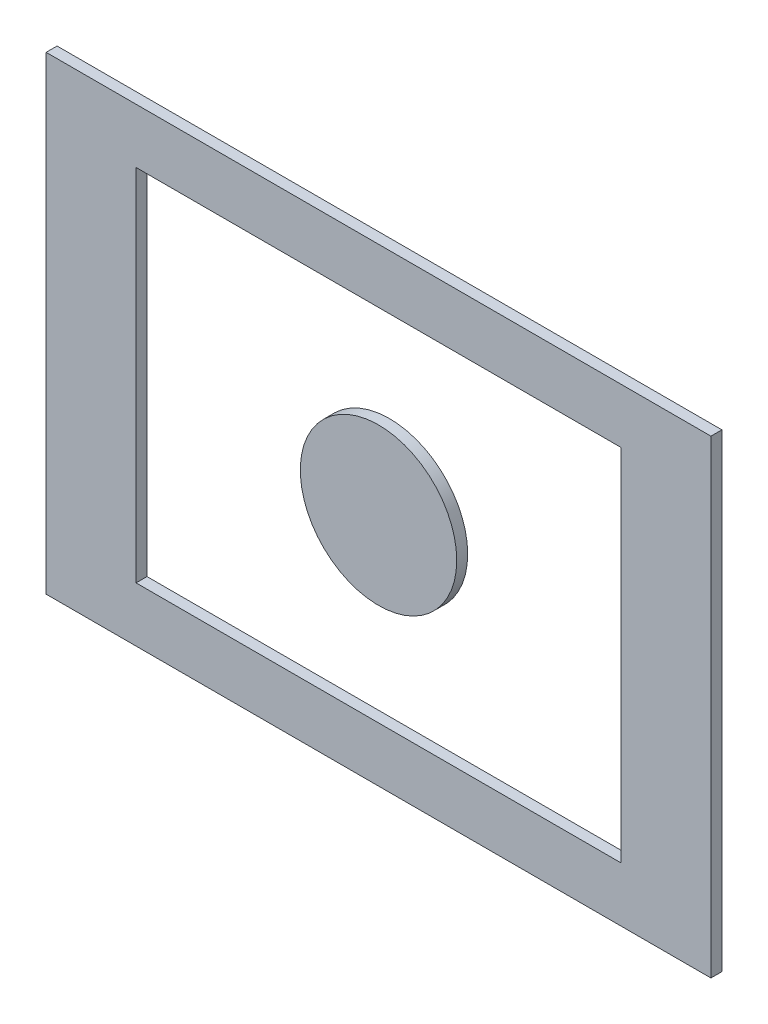
ISO-10303-21;
HEADER;
FILE_DESCRIPTION(('STEP AP214'),'2;1');
FILE_NAME('part.step','',(''),(''),'','','');
FILE_SCHEMA(('AUTOMOTIVE_DESIGN { 1 0 10303 214 1 1 1 1 }'));
ENDSEC;
DATA;
#1=APPLICATION_CONTEXT('core data for automotive mechanical design processes');
#2=APPLICATION_PROTOCOL_DEFINITION('international standard','automotive_design',2000,#1);
#3=PRODUCT_CONTEXT('',#1,'mechanical');
#4=PRODUCT('Part','Part','',(#3));
#5=PRODUCT_RELATED_PRODUCT_CATEGORY('part','',(#4));
#6=PRODUCT_DEFINITION_FORMATION('','',#4);
#7=PRODUCT_DEFINITION_CONTEXT('part definition',#1,'design');
#8=PRODUCT_DEFINITION('design','',#6,#7);
#9=PRODUCT_DEFINITION_SHAPE('','',#8);
#10=(LENGTH_UNIT() NAMED_UNIT(*) SI_UNIT(.MILLI.,.METRE.));
#11=(NAMED_UNIT(*) PLANE_ANGLE_UNIT() SI_UNIT($,.RADIAN.));
#12=(NAMED_UNIT(*) SI_UNIT($,.STERADIAN.) SOLID_ANGLE_UNIT());
#13=UNCERTAINTY_MEASURE_WITH_UNIT(LENGTH_MEASURE(1.E-05),#10,'distance_accuracy_value','');
#14=(GEOMETRIC_REPRESENTATION_CONTEXT(3) GLOBAL_UNCERTAINTY_ASSIGNED_CONTEXT((#13)) GLOBAL_UNIT_ASSIGNED_CONTEXT((#10,
#11,#12)) REPRESENTATION_CONTEXT('',''));
#15=CARTESIAN_POINT('',(0.,0.,0.));
#16=DIRECTION('',(0.,0.,1.));
#17=DIRECTION('',(1.,0.,0.));
#18=AXIS2_PLACEMENT_3D('',#15,#16,#17);
#19=CARTESIAN_POINT('',(0.,0.,0.));
#20=DIRECTION('',(0.,0.,1.));
#21=DIRECTION('',(1.,0.,0.));
#22=AXIS2_PLACEMENT_3D('',#19,#20,#21);
#23=CYLINDRICAL_SURFACE('',#22,10.);
#24=CARTESIAN_POINT('',(0.,0.,0.));
#25=DIRECTION('',(0.,0.,1.));
#26=DIRECTION('',(1.,0.,0.));
#27=AXIS2_PLACEMENT_3D('',#24,#25,#26);
#28=CIRCLE('',#27,10.);
#29=CARTESIAN_POINT('',(10.,0.,0.));
#30=VERTEX_POINT('',#29);
#31=EDGE_CURVE('E11',#30,#30,#28,.T.);
#32=ORIENTED_EDGE('',*,*,#31,.T.);
#33=EDGE_LOOP('',(#32));
#34=FACE_BOUND('',#33,.T.);
#35=CARTESIAN_POINT('',(0.,0.,1.4));
#36=DIRECTION('',(0.,0.,1.));
#37=DIRECTION('',(1.,0.,0.));
#38=AXIS2_PLACEMENT_3D('',#35,#36,#37);
#39=CIRCLE('',#38,10.);
#40=CARTESIAN_POINT('',(10.,0.,1.4));
#41=VERTEX_POINT('',#40);
#42=EDGE_CURVE('E56',#41,#41,#39,.T.);
#43=ORIENTED_EDGE('',*,*,#42,.F.);
#44=EDGE_LOOP('',(#43));
#45=FACE_BOUND('',#44,.T.);
#46=ADVANCED_FACE('F53',(#34,#45),#23,.T.);
#47=CARTESIAN_POINT('',(0.,0.,0.));
#48=DIRECTION('',(0.,0.,1.));
#49=DIRECTION('',(1.,0.,0.));
#50=AXIS2_PLACEMENT_3D('',#47,#48,#49);
#51=PLANE('',#50);
#52=ORIENTED_EDGE('',*,*,#31,.F.);
#53=EDGE_LOOP('',(#52));
#54=FACE_BOUND('',#53,.T.);
#55=ADVANCED_FACE('F68',(#54),#51,.F.);
#56=CARTESIAN_POINT('',(0.,0.,1.4));
#57=DIRECTION('',(0.,0.,1.));
#58=DIRECTION('',(1.,0.,0.));
#59=AXIS2_PLACEMENT_3D('',#56,#57,#58);
#60=PLANE('',#59);
#61=ORIENTED_EDGE('',*,*,#42,.T.);
#62=EDGE_LOOP('',(#61));
#63=FACE_BOUND('',#62,.T.);
#64=ADVANCED_FACE('F65',(#63),#60,.T.);
#65=CLOSED_SHELL('',(#46,#55,#64));
#66=MANIFOLD_SOLID_BREP('B2',#65);
#67=CARTESIAN_POINT('',(0.,0.,1.4));
#68=DIRECTION('',(0.,0.,1.));
#69=DIRECTION('',(1.,0.,0.));
#70=AXIS2_PLACEMENT_3D('',#67,#68,#69);
#71=PLANE('',#70);
#72=DIRECTION('',(0.,1.,0.));
#73=VECTOR('',#72,1.);
#74=CARTESIAN_POINT('',(42.5,30.,1.4));
#75=LINE('',#74,#73);
#76=CARTESIAN_POINT('',(42.5,-30.,1.4));
#77=VERTEX_POINT('',#76);
#78=CARTESIAN_POINT('',(42.5,30.,1.4));
#79=VERTEX_POINT('',#78);
#80=EDGE_CURVE('E207',#77,#79,#75,.T.);
#81=ORIENTED_EDGE('',*,*,#80,.T.);
#82=DIRECTION('',(-1.,0.,0.));
#83=VECTOR('',#82,1.);
#84=CARTESIAN_POINT('',(-42.5,30.,1.4));
#85=LINE('',#84,#83);
#86=CARTESIAN_POINT('',(-42.5,30.,1.4));
#87=VERTEX_POINT('',#86);
#88=EDGE_CURVE('E211',#79,#87,#85,.T.);
#89=ORIENTED_EDGE('',*,*,#88,.T.);
#90=DIRECTION('',(0.,-1.,0.));
#91=VECTOR('',#90,1.);
#92=CARTESIAN_POINT('',(-42.5,30.,1.4));
#93=LINE('',#92,#91);
#94=CARTESIAN_POINT('',(-42.5,-30.,1.4));
#95=VERTEX_POINT('',#94);
#96=EDGE_CURVE('E215',#87,#95,#93,.T.);
#97=ORIENTED_EDGE('',*,*,#96,.T.);
#98=DIRECTION('',(1.,0.,0.));
#99=VECTOR('',#98,1.);
#100=CARTESIAN_POINT('',(-42.5,-30.,1.4));
#101=LINE('',#100,#99);
#102=EDGE_CURVE('E218',#95,#77,#101,.T.);
#103=ORIENTED_EDGE('',*,*,#102,.T.);
#104=EDGE_LOOP('',(#81,#89,#97,#103));
#105=FACE_BOUND('',#104,.T.);
#106=DIRECTION('',(-1.,0.,0.));
#107=VECTOR('',#106,1.);
#108=CARTESIAN_POINT('',(-31.,23.,1.4));
#109=LINE('',#108,#107);
#110=CARTESIAN_POINT('',(31.,23.,1.4));
#111=VERTEX_POINT('',#110);
#112=CARTESIAN_POINT('',(-31.,23.,1.4));
#113=VERTEX_POINT('',#112);
#114=EDGE_CURVE('E168',#111,#113,#109,.T.);
#115=ORIENTED_EDGE('',*,*,#114,.F.);
#116=DIRECTION('',(0.,1.,0.));
#117=VECTOR('',#116,1.);
#118=CARTESIAN_POINT('',(31.,23.,1.4));
#119=LINE('',#118,#117);
#120=CARTESIAN_POINT('',(31.,-23.,1.4));
#121=VERTEX_POINT('',#120);
#122=EDGE_CURVE('E159',#121,#111,#119,.T.);
#123=ORIENTED_EDGE('',*,*,#122,.F.);
#124=DIRECTION('',(1.,0.,0.));
#125=VECTOR('',#124,1.);
#126=CARTESIAN_POINT('',(-31.,-23.,1.4));
#127=LINE('',#126,#125);
#128=CARTESIAN_POINT('',(-31.,-23.,1.4));
#129=VERTEX_POINT('',#128);
#130=EDGE_CURVE('E185',#129,#121,#127,.T.);
#131=ORIENTED_EDGE('',*,*,#130,.F.);
#132=DIRECTION('',(0.,-1.,0.));
#133=VECTOR('',#132,1.);
#134=CARTESIAN_POINT('',(-31.,23.,1.4));
#135=LINE('',#134,#133);
#136=EDGE_CURVE('E181',#113,#129,#135,.T.);
#137=ORIENTED_EDGE('',*,*,#136,.F.);
#138=EDGE_LOOP('',(#115,#123,#131,#137));
#139=FACE_BOUND('',#138,.T.);
#140=ADVANCED_FACE('F93',(#105,#139),#71,.T.);
#141=CARTESIAN_POINT('',(0.,0.,0.));
#142=DIRECTION('',(0.,0.,1.));
#143=DIRECTION('',(1.,0.,0.));
#144=AXIS2_PLACEMENT_3D('',#141,#142,#143);
#145=PLANE('',#144);
#146=DIRECTION('',(0.,1.,0.));
#147=VECTOR('',#146,1.);
#148=CARTESIAN_POINT('',(42.5,30.,0.));
#149=LINE('',#148,#147);
#150=CARTESIAN_POINT('',(42.5,-30.,0.));
#151=VERTEX_POINT('',#150);
#152=CARTESIAN_POINT('',(42.5,30.,0.));
#153=VERTEX_POINT('',#152);
#154=EDGE_CURVE('E177',#151,#153,#149,.T.);
#155=ORIENTED_EDGE('',*,*,#154,.F.);
#156=DIRECTION('',(1.,0.,0.));
#157=VECTOR('',#156,1.);
#158=CARTESIAN_POINT('',(-42.5,-30.,0.));
#159=LINE('',#158,#157);
#160=CARTESIAN_POINT('',(-42.5,-30.,0.));
#161=VERTEX_POINT('',#160);
#162=EDGE_CURVE('E212',#161,#151,#159,.T.);
#163=ORIENTED_EDGE('',*,*,#162,.F.);
#164=DIRECTION('',(0.,-1.,0.));
#165=VECTOR('',#164,1.);
#166=CARTESIAN_POINT('',(-42.5,30.,0.));
#167=LINE('',#166,#165);
#168=CARTESIAN_POINT('',(-42.5,30.,0.));
#169=VERTEX_POINT('',#168);
#170=EDGE_CURVE('E228',#169,#161,#167,.T.);
#171=ORIENTED_EDGE('',*,*,#170,.F.);
#172=DIRECTION('',(-1.,0.,0.));
#173=VECTOR('',#172,1.);
#174=CARTESIAN_POINT('',(-42.5,30.,0.));
#175=LINE('',#174,#173);
#176=EDGE_CURVE('E225',#153,#169,#175,.T.);
#177=ORIENTED_EDGE('',*,*,#176,.F.);
#178=EDGE_LOOP('',(#155,#163,#171,#177));
#179=FACE_BOUND('',#178,.T.);
#180=DIRECTION('',(0.,1.,0.));
#181=VECTOR('',#180,1.);
#182=CARTESIAN_POINT('',(31.,23.,0.));
#183=LINE('',#182,#181);
#184=CARTESIAN_POINT('',(31.,-23.,0.));
#185=VERTEX_POINT('',#184);
#186=CARTESIAN_POINT('',(31.,23.,0.));
#187=VERTEX_POINT('',#186);
#188=EDGE_CURVE('E117',#185,#187,#183,.T.);
#189=ORIENTED_EDGE('',*,*,#188,.T.);
#190=DIRECTION('',(-1.,0.,0.));
#191=VECTOR('',#190,1.);
#192=CARTESIAN_POINT('',(-31.,23.,0.));
#193=LINE('',#192,#191);
#194=CARTESIAN_POINT('',(-31.,23.,0.));
#195=VERTEX_POINT('',#194);
#196=EDGE_CURVE('E175',#187,#195,#193,.T.);
#197=ORIENTED_EDGE('',*,*,#196,.T.);
#198=DIRECTION('',(0.,-1.,0.));
#199=VECTOR('',#198,1.);
#200=CARTESIAN_POINT('',(-31.,23.,0.));
#201=LINE('',#200,#199);
#202=CARTESIAN_POINT('',(-31.,-23.,0.));
#203=VERTEX_POINT('',#202);
#204=EDGE_CURVE('E194',#195,#203,#201,.T.);
#205=ORIENTED_EDGE('',*,*,#204,.T.);
#206=DIRECTION('',(1.,0.,0.));
#207=VECTOR('',#206,1.);
#208=CARTESIAN_POINT('',(-31.,-23.,0.));
#209=LINE('',#208,#207);
#210=EDGE_CURVE('E169',#203,#185,#209,.T.);
#211=ORIENTED_EDGE('',*,*,#210,.T.);
#212=EDGE_LOOP('',(#189,#197,#205,#211));
#213=FACE_BOUND('',#212,.T.);
#214=ADVANCED_FACE('F251',(#179,#213),#145,.F.);
#215=CARTESIAN_POINT('',(42.5,30.,1.4));
#216=DIRECTION('',(-1.,0.,0.));
#217=DIRECTION('',(0.,0.,1.));
#218=AXIS2_PLACEMENT_3D('',#215,#216,#217);
#219=PLANE('',#218);
#220=ORIENTED_EDGE('',*,*,#154,.T.);
#221=DIRECTION('',(0.,0.,-1.));
#222=VECTOR('',#221,1.);
#223=CARTESIAN_POINT('',(42.5,30.,1.4));
#224=LINE('',#223,#222);
#225=EDGE_CURVE('E51',#79,#153,#224,.T.);
#226=ORIENTED_EDGE('',*,*,#225,.F.);
#227=ORIENTED_EDGE('',*,*,#80,.F.);
#228=DIRECTION('',(0.,0.,-1.));
#229=VECTOR('',#228,1.);
#230=CARTESIAN_POINT('',(42.5,-30.,1.4));
#231=LINE('',#230,#229);
#232=EDGE_CURVE('E221',#77,#151,#231,.T.);
#233=ORIENTED_EDGE('',*,*,#232,.T.);
#234=EDGE_LOOP('',(#220,#226,#227,#233));
#235=FACE_BOUND('',#234,.T.);
#236=ADVANCED_FACE('F95',(#235),#219,.F.);
#237=CARTESIAN_POINT('',(-42.5,30.,1.4));
#238=DIRECTION('',(0.,-1.,0.));
#239=DIRECTION('',(0.,0.,-1.));
#240=AXIS2_PLACEMENT_3D('',#237,#238,#239);
#241=PLANE('',#240);
#242=ORIENTED_EDGE('',*,*,#176,.T.);
#243=DIRECTION('',(0.,0.,-1.));
#244=VECTOR('',#243,1.);
#245=CARTESIAN_POINT('',(-42.5,30.,1.4));
#246=LINE('',#245,#244);
#247=EDGE_CURVE('E102',#87,#169,#246,.T.);
#248=ORIENTED_EDGE('',*,*,#247,.F.);
#249=ORIENTED_EDGE('',*,*,#88,.F.);
#250=ORIENTED_EDGE('',*,*,#225,.T.);
#251=EDGE_LOOP('',(#242,#248,#249,#250));
#252=FACE_BOUND('',#251,.T.);
#253=ADVANCED_FACE('F261',(#252),#241,.F.);
#254=CARTESIAN_POINT('',(-42.5,30.,1.4));
#255=DIRECTION('',(1.,0.,0.));
#256=DIRECTION('',(0.,0.,-1.));
#257=AXIS2_PLACEMENT_3D('',#254,#255,#256);
#258=PLANE('',#257);
#259=ORIENTED_EDGE('',*,*,#170,.T.);
#260=DIRECTION('',(0.,0.,-1.));
#261=VECTOR('',#260,1.);
#262=CARTESIAN_POINT('',(-42.5,-30.,1.4));
#263=LINE('',#262,#261);
#264=EDGE_CURVE('E236',#95,#161,#263,.T.);
#265=ORIENTED_EDGE('',*,*,#264,.F.);
#266=ORIENTED_EDGE('',*,*,#96,.F.);
#267=ORIENTED_EDGE('',*,*,#247,.T.);
#268=EDGE_LOOP('',(#259,#265,#266,#267));
#269=FACE_BOUND('',#268,.T.);
#270=ADVANCED_FACE('F245',(#269),#258,.F.);
#271=CARTESIAN_POINT('',(-42.5,-30.,1.4));
#272=DIRECTION('',(0.,1.,0.));
#273=DIRECTION('',(0.,0.,1.));
#274=AXIS2_PLACEMENT_3D('',#271,#272,#273);
#275=PLANE('',#274);
#276=ORIENTED_EDGE('',*,*,#162,.T.);
#277=ORIENTED_EDGE('',*,*,#232,.F.);
#278=ORIENTED_EDGE('',*,*,#102,.F.);
#279=ORIENTED_EDGE('',*,*,#264,.T.);
#280=EDGE_LOOP('',(#276,#277,#278,#279));
#281=FACE_BOUND('',#280,.T.);
#282=ADVANCED_FACE('F255',(#281),#275,.F.);
#283=CARTESIAN_POINT('',(31.,23.,1.4));
#284=DIRECTION('',(-1.,0.,0.));
#285=DIRECTION('',(0.,0.,1.));
#286=AXIS2_PLACEMENT_3D('',#283,#284,#285);
#287=PLANE('',#286);
#288=ORIENTED_EDGE('',*,*,#188,.F.);
#289=DIRECTION('',(0.,0.,-1.));
#290=VECTOR('',#289,1.);
#291=CARTESIAN_POINT('',(31.,-23.,1.4));
#292=LINE('',#291,#290);
#293=EDGE_CURVE('E163',#121,#185,#292,.T.);
#294=ORIENTED_EDGE('',*,*,#293,.F.);
#295=ORIENTED_EDGE('',*,*,#122,.T.);
#296=DIRECTION('',(0.,0.,-1.));
#297=VECTOR('',#296,1.);
#298=CARTESIAN_POINT('',(31.,23.,1.4));
#299=LINE('',#298,#297);
#300=EDGE_CURVE('E162',#111,#187,#299,.T.);
#301=ORIENTED_EDGE('',*,*,#300,.T.);
#302=EDGE_LOOP('',(#288,#294,#295,#301));
#303=FACE_BOUND('',#302,.T.);
#304=ADVANCED_FACE('F161',(#303),#287,.T.);
#305=CARTESIAN_POINT('',(-31.,23.,1.4));
#306=DIRECTION('',(0.,-1.,0.));
#307=DIRECTION('',(0.,0.,-1.));
#308=AXIS2_PLACEMENT_3D('',#305,#306,#307);
#309=PLANE('',#308);
#310=ORIENTED_EDGE('',*,*,#196,.F.);
#311=ORIENTED_EDGE('',*,*,#300,.F.);
#312=ORIENTED_EDGE('',*,*,#114,.T.);
#313=DIRECTION('',(0.,0.,-1.));
#314=VECTOR('',#313,1.);
#315=CARTESIAN_POINT('',(-31.,23.,1.4));
#316=LINE('',#315,#314);
#317=EDGE_CURVE('E178',#113,#195,#316,.T.);
#318=ORIENTED_EDGE('',*,*,#317,.T.);
#319=EDGE_LOOP('',(#310,#311,#312,#318));
#320=FACE_BOUND('',#319,.T.);
#321=ADVANCED_FACE('F172',(#320),#309,.T.);
#322=CARTESIAN_POINT('',(-31.,23.,1.4));
#323=DIRECTION('',(1.,0.,0.));
#324=DIRECTION('',(0.,0.,-1.));
#325=AXIS2_PLACEMENT_3D('',#322,#323,#324);
#326=PLANE('',#325);
#327=ORIENTED_EDGE('',*,*,#204,.F.);
#328=ORIENTED_EDGE('',*,*,#317,.F.);
#329=ORIENTED_EDGE('',*,*,#136,.T.);
#330=DIRECTION('',(0.,0.,-1.));
#331=VECTOR('',#330,1.);
#332=CARTESIAN_POINT('',(-31.,-23.,1.4));
#333=LINE('',#332,#331);
#334=EDGE_CURVE('E109',#129,#203,#333,.T.);
#335=ORIENTED_EDGE('',*,*,#334,.T.);
#336=EDGE_LOOP('',(#327,#328,#329,#335));
#337=FACE_BOUND('',#336,.T.);
#338=ADVANCED_FACE('F284',(#337),#326,.T.);
#339=CARTESIAN_POINT('',(-31.,-23.,1.4));
#340=DIRECTION('',(0.,1.,0.));
#341=DIRECTION('',(0.,0.,1.));
#342=AXIS2_PLACEMENT_3D('',#339,#340,#341);
#343=PLANE('',#342);
#344=ORIENTED_EDGE('',*,*,#210,.F.);
#345=ORIENTED_EDGE('',*,*,#334,.F.);
#346=ORIENTED_EDGE('',*,*,#130,.T.);
#347=ORIENTED_EDGE('',*,*,#293,.T.);
#348=EDGE_LOOP('',(#344,#345,#346,#347));
#349=FACE_BOUND('',#348,.T.);
#350=ADVANCED_FACE('F288',(#349),#343,.T.);
#351=CLOSED_SHELL('',(#140,#214,#236,#253,#270,#282,#304,#321,#338,#350));
#352=MANIFOLD_SOLID_BREP('B6',#351);
#353=ADVANCED_BREP_SHAPE_REPRESENTATION('',(#18,#66,#352),#14);
#354=SHAPE_DEFINITION_REPRESENTATION(#9,#353);
ENDSEC;
END-ISO-10303-21;
